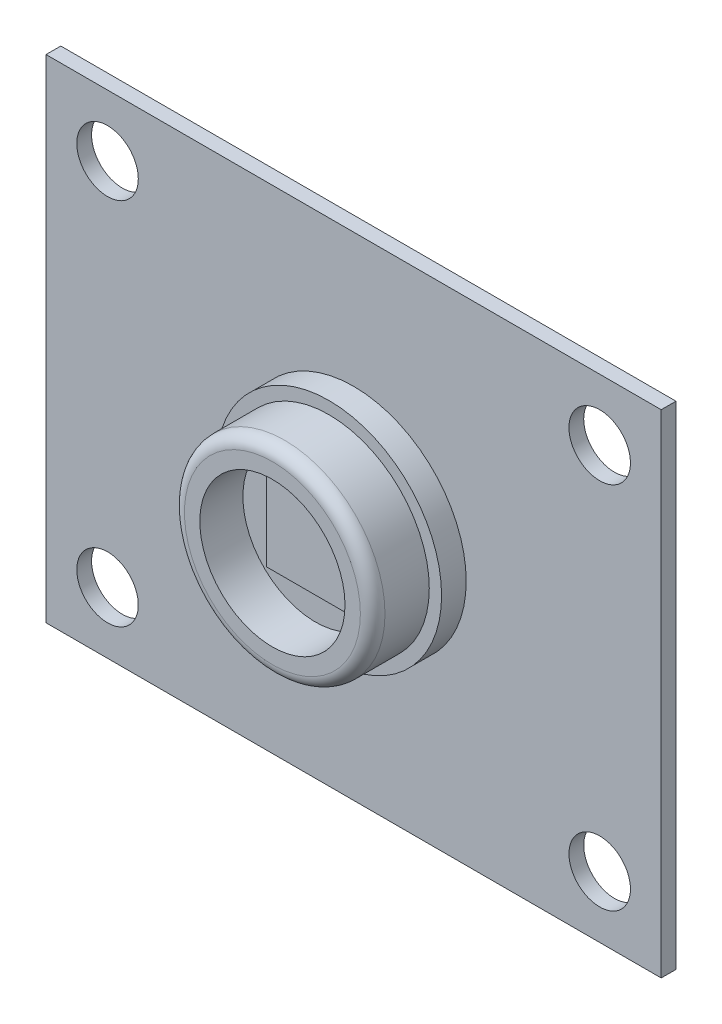
ISO-10303-21;
HEADER;
FILE_DESCRIPTION(('STEP AP214'),'2;1');
FILE_NAME('part.step','',(''),(''),'','','');
FILE_SCHEMA(('AUTOMOTIVE_DESIGN { 1 0 10303 214 1 1 1 1 }'));
ENDSEC;
DATA;
#1=APPLICATION_CONTEXT('core data for automotive mechanical design processes');
#2=APPLICATION_PROTOCOL_DEFINITION('international standard','automotive_design',2000,#1);
#3=PRODUCT_CONTEXT('',#1,'mechanical');
#4=PRODUCT('Part','Part','',(#3));
#5=PRODUCT_RELATED_PRODUCT_CATEGORY('part','',(#4));
#6=PRODUCT_DEFINITION_FORMATION('','',#4);
#7=PRODUCT_DEFINITION_CONTEXT('part definition',#1,'design');
#8=PRODUCT_DEFINITION('design','',#6,#7);
#9=PRODUCT_DEFINITION_SHAPE('','',#8);
#10=(LENGTH_UNIT() NAMED_UNIT(*) SI_UNIT(.MILLI.,.METRE.));
#11=(NAMED_UNIT(*) PLANE_ANGLE_UNIT() SI_UNIT($,.RADIAN.));
#12=(NAMED_UNIT(*) SI_UNIT($,.STERADIAN.) SOLID_ANGLE_UNIT());
#13=UNCERTAINTY_MEASURE_WITH_UNIT(LENGTH_MEASURE(1.E-05),#10,'distance_accuracy_value','');
#14=(GEOMETRIC_REPRESENTATION_CONTEXT(3) GLOBAL_UNCERTAINTY_ASSIGNED_CONTEXT((#13)) GLOBAL_UNIT_ASSIGNED_CONTEXT((#10,
#11,#12)) REPRESENTATION_CONTEXT('',''));
#15=CARTESIAN_POINT('',(0.,0.,0.));
#16=DIRECTION('',(0.,0.,1.));
#17=DIRECTION('',(1.,0.,0.));
#18=AXIS2_PLACEMENT_3D('',#15,#16,#17);
#19=CARTESIAN_POINT('',(1.9,-1.9,-1.65));
#20=DIRECTION('',(-1.,0.,0.));
#21=DIRECTION('',(0.,0.,1.));
#22=AXIS2_PLACEMENT_3D('',#19,#20,#21);
#23=PLANE('',#22);
#24=DIRECTION('',(0.,1.,0.));
#25=VECTOR('',#24,1.);
#26=CARTESIAN_POINT('',(1.9,-1.9,-1.75));
#27=LINE('',#26,#25);
#28=CARTESIAN_POINT('',(1.9,-1.9,-1.75));
#29=VERTEX_POINT('',#28);
#30=CARTESIAN_POINT('',(1.9,1.9,-1.75));
#31=VERTEX_POINT('',#30);
#32=EDGE_CURVE('E107',#29,#31,#27,.T.);
#33=ORIENTED_EDGE('',*,*,#32,.T.);
#34=DIRECTION('',(0.,0.,-1.));
#35=VECTOR('',#34,1.);
#36=CARTESIAN_POINT('',(1.9,1.9,-1.65));
#37=LINE('',#36,#35);
#38=CARTESIAN_POINT('',(1.9,1.9,-1.65));
#39=VERTEX_POINT('',#38);
#40=EDGE_CURVE('E12',#39,#31,#37,.T.);
#41=ORIENTED_EDGE('',*,*,#40,.F.);
#42=DIRECTION('',(0.,1.,0.));
#43=VECTOR('',#42,1.);
#44=CARTESIAN_POINT('',(1.9,-1.9,-1.65));
#45=LINE('',#44,#43);
#46=CARTESIAN_POINT('',(1.9,-1.9,-1.65));
#47=VERTEX_POINT('',#46);
#48=EDGE_CURVE('E95',#47,#39,#45,.T.);
#49=ORIENTED_EDGE('',*,*,#48,.F.);
#50=DIRECTION('',(0.,0.,-1.));
#51=VECTOR('',#50,1.);
#52=CARTESIAN_POINT('',(1.9,-1.9,-1.65));
#53=LINE('',#52,#51);
#54=EDGE_CURVE('E103',#47,#29,#53,.T.);
#55=ORIENTED_EDGE('',*,*,#54,.T.);
#56=EDGE_LOOP('',(#33,#41,#49,#55));
#57=FACE_BOUND('',#56,.T.);
#58=ADVANCED_FACE('F44',(#57),#23,.F.);
#59=CARTESIAN_POINT('',(-1.9,1.9,-1.65));
#60=DIRECTION('',(0.,-1.,0.));
#61=DIRECTION('',(0.,0.,-1.));
#62=AXIS2_PLACEMENT_3D('',#59,#60,#61);
#63=PLANE('',#62);
#64=DIRECTION('',(-1.,0.,0.));
#65=VECTOR('',#64,1.);
#66=CARTESIAN_POINT('',(-1.9,1.9,-1.75));
#67=LINE('',#66,#65);
#68=CARTESIAN_POINT('',(-1.9,1.9,-1.75));
#69=VERTEX_POINT('',#68);
#70=EDGE_CURVE('E99',#31,#69,#67,.T.);
#71=ORIENTED_EDGE('',*,*,#70,.T.);
#72=DIRECTION('',(0.,0.,-1.));
#73=VECTOR('',#72,1.);
#74=CARTESIAN_POINT('',(-1.9,1.9,-1.65));
#75=LINE('',#74,#73);
#76=CARTESIAN_POINT('',(-1.9,1.9,-1.65));
#77=VERTEX_POINT('',#76);
#78=EDGE_CURVE('E52',#77,#69,#75,.T.);
#79=ORIENTED_EDGE('',*,*,#78,.F.);
#80=DIRECTION('',(-1.,0.,0.));
#81=VECTOR('',#80,1.);
#82=CARTESIAN_POINT('',(-1.9,1.9,-1.65));
#83=LINE('',#82,#81);
#84=EDGE_CURVE('E90',#39,#77,#83,.T.);
#85=ORIENTED_EDGE('',*,*,#84,.F.);
#86=ORIENTED_EDGE('',*,*,#40,.T.);
#87=EDGE_LOOP('',(#71,#79,#85,#86));
#88=FACE_BOUND('',#87,.T.);
#89=ADVANCED_FACE('F98',(#88),#63,.F.);
#90=CARTESIAN_POINT('',(-1.9,-1.9,-1.65));
#91=DIRECTION('',(1.,0.,0.));
#92=DIRECTION('',(0.,0.,-1.));
#93=AXIS2_PLACEMENT_3D('',#90,#91,#92);
#94=PLANE('',#93);
#95=DIRECTION('',(0.,-1.,0.));
#96=VECTOR('',#95,1.);
#97=CARTESIAN_POINT('',(-1.9,-1.9,-1.75));
#98=LINE('',#97,#96);
#99=CARTESIAN_POINT('',(-1.9,-1.9,-1.75));
#100=VERTEX_POINT('',#99);
#101=EDGE_CURVE('E77',#69,#100,#98,.T.);
#102=ORIENTED_EDGE('',*,*,#101,.T.);
#103=DIRECTION('',(0.,0.,-1.));
#104=VECTOR('',#103,1.);
#105=CARTESIAN_POINT('',(-1.9,-1.9,-1.65));
#106=LINE('',#105,#104);
#107=CARTESIAN_POINT('',(-1.9,-1.9,-1.65));
#108=VERTEX_POINT('',#107);
#109=EDGE_CURVE('E100',#108,#100,#106,.T.);
#110=ORIENTED_EDGE('',*,*,#109,.F.);
#111=DIRECTION('',(0.,-1.,0.));
#112=VECTOR('',#111,1.);
#113=CARTESIAN_POINT('',(-1.9,-1.9,-1.65));
#114=LINE('',#113,#112);
#115=EDGE_CURVE('E93',#77,#108,#114,.T.);
#116=ORIENTED_EDGE('',*,*,#115,.F.);
#117=ORIENTED_EDGE('',*,*,#78,.T.);
#118=EDGE_LOOP('',(#102,#110,#116,#117));
#119=FACE_BOUND('',#118,.T.);
#120=ADVANCED_FACE('F101',(#119),#94,.F.);
#121=CARTESIAN_POINT('',(-1.9,-1.9,-1.65));
#122=DIRECTION('',(0.,1.,0.));
#123=DIRECTION('',(0.,0.,1.));
#124=AXIS2_PLACEMENT_3D('',#121,#122,#123);
#125=PLANE('',#124);
#126=DIRECTION('',(1.,0.,0.));
#127=VECTOR('',#126,1.);
#128=CARTESIAN_POINT('',(-1.9,-1.9,-1.75));
#129=LINE('',#128,#127);
#130=EDGE_CURVE('E83',#100,#29,#129,.T.);
#131=ORIENTED_EDGE('',*,*,#130,.T.);
#132=ORIENTED_EDGE('',*,*,#54,.F.);
#133=DIRECTION('',(1.,0.,0.));
#134=VECTOR('',#133,1.);
#135=CARTESIAN_POINT('',(-1.9,-1.9,-1.65));
#136=LINE('',#135,#134);
#137=EDGE_CURVE('E60',#108,#47,#136,.T.);
#138=ORIENTED_EDGE('',*,*,#137,.F.);
#139=ORIENTED_EDGE('',*,*,#109,.T.);
#140=EDGE_LOOP('',(#131,#132,#138,#139));
#141=FACE_BOUND('',#140,.T.);
#142=ADVANCED_FACE('F114',(#141),#125,.F.);
#143=CARTESIAN_POINT('',(0.,0.,-1.65));
#144=DIRECTION('',(0.,0.,-1.));
#145=DIRECTION('',(-1.,0.,0.));
#146=AXIS2_PLACEMENT_3D('',#143,#144,#145);
#147=PLANE('',#146);
#148=ORIENTED_EDGE('',*,*,#48,.T.);
#149=ORIENTED_EDGE('',*,*,#84,.T.);
#150=ORIENTED_EDGE('',*,*,#115,.T.);
#151=ORIENTED_EDGE('',*,*,#137,.T.);
#152=EDGE_LOOP('',(#148,#149,#150,#151));
#153=FACE_BOUND('',#152,.T.);
#154=ADVANCED_FACE('F91',(#153),#147,.F.);
#155=CARTESIAN_POINT('',(0.,0.,-1.75));
#156=DIRECTION('',(0.,0.,-1.));
#157=DIRECTION('',(-1.,0.,0.));
#158=AXIS2_PLACEMENT_3D('',#155,#156,#157);
#159=PLANE('',#158);
#160=ORIENTED_EDGE('',*,*,#32,.F.);
#161=ORIENTED_EDGE('',*,*,#130,.F.);
#162=ORIENTED_EDGE('',*,*,#101,.F.);
#163=ORIENTED_EDGE('',*,*,#70,.F.);
#164=EDGE_LOOP('',(#160,#161,#162,#163));
#165=FACE_BOUND('',#164,.T.);
#166=ADVANCED_FACE('F117',(#165),#159,.T.);
#167=CLOSED_SHELL('',(#58,#89,#120,#142,#154,#166));
#168=MANIFOLD_SOLID_BREP('B2',#167);
#169=CARTESIAN_POINT('',(0.,0.,-3.3));
#170=DIRECTION('',(0.,0.,1.));
#171=DIRECTION('',(1.,0.,0.));
#172=AXIS2_PLACEMENT_3D('',#169,#170,#171);
#173=CYLINDRICAL_SURFACE('',#172,4.075);
#174=CARTESIAN_POINT('',(0.,0.,-0.5));
#175=DIRECTION('',(0.,0.,1.));
#176=DIRECTION('',(1.,0.,0.));
#177=AXIS2_PLACEMENT_3D('',#174,#175,#176);
#178=CIRCLE('',#177,4.075);
#179=CARTESIAN_POINT('',(4.075,0.,-0.5));
#180=VERTEX_POINT('',#179);
#181=EDGE_CURVE('E270',#180,#180,#178,.F.);
#182=ORIENTED_EDGE('',*,*,#181,.T.);
#183=EDGE_LOOP('',(#182));
#184=FACE_BOUND('',#183,.T.);
#185=CARTESIAN_POINT('',(0.,0.,-2.3));
#186=DIRECTION('',(0.,0.,-1.));
#187=DIRECTION('',(-1.,0.,0.));
#188=AXIS2_PLACEMENT_3D('',#185,#186,#187);
#189=CIRCLE('',#188,4.075);
#190=CARTESIAN_POINT('',(-4.075,0.,-2.3));
#191=VERTEX_POINT('',#190);
#192=EDGE_CURVE('E263',#191,#191,#189,.F.);
#193=ORIENTED_EDGE('',*,*,#192,.T.);
#194=EDGE_LOOP('',(#193));
#195=FACE_BOUND('',#194,.T.);
#196=ADVANCED_FACE('F167',(#184,#195),#173,.T.);
#197=CARTESIAN_POINT('',(0.,0.,0.));
#198=DIRECTION('',(0.,0.,1.));
#199=DIRECTION('',(1.,0.,0.));
#200=AXIS2_PLACEMENT_3D('',#197,#198,#199);
#201=PLANE('',#200);
#202=CARTESIAN_POINT('',(0.,0.,0.));
#203=DIRECTION('',(0.,0.,1.));
#204=DIRECTION('',(1.,0.,0.));
#205=AXIS2_PLACEMENT_3D('',#202,#203,#204);
#206=CIRCLE('',#205,3.575);
#207=CARTESIAN_POINT('',(3.575,0.,0.));
#208=VERTEX_POINT('',#207);
#209=EDGE_CURVE('E268',#208,#208,#206,.T.);
#210=ORIENTED_EDGE('',*,*,#209,.T.);
#211=EDGE_LOOP('',(#210));
#212=FACE_BOUND('',#211,.T.);
#213=CARTESIAN_POINT('',(0.,0.,0.));
#214=DIRECTION('',(0.,0.,1.));
#215=DIRECTION('',(1.,0.,0.));
#216=AXIS2_PLACEMENT_3D('',#213,#214,#215);
#217=CIRCLE('',#216,2.95);
#218=CARTESIAN_POINT('',(2.95,0.,0.));
#219=VERTEX_POINT('',#218);
#220=EDGE_CURVE('E253',#219,#219,#217,.T.);
#221=ORIENTED_EDGE('',*,*,#220,.F.);
#222=EDGE_LOOP('',(#221));
#223=FACE_BOUND('',#222,.T.);
#224=ADVANCED_FACE('F296',(#212,#223),#201,.T.);
#225=CARTESIAN_POINT('',(0.,0.,-2.3));
#226=DIRECTION('',(0.,0.,-1.));
#227=DIRECTION('',(-1.,0.,0.));
#228=AXIS2_PLACEMENT_3D('',#225,#226,#227);
#229=CYLINDRICAL_SURFACE('',#228,4.575);
#230=CARTESIAN_POINT('',(0.,0.,-2.3));
#231=DIRECTION('',(0.,0.,-1.));
#232=DIRECTION('',(-1.,0.,0.));
#233=AXIS2_PLACEMENT_3D('',#230,#231,#232);
#234=CIRCLE('',#233,4.575);
#235=CARTESIAN_POINT('',(-4.575,0.,-2.3));
#236=VERTEX_POINT('',#235);
#237=EDGE_CURVE('E260',#236,#236,#234,.T.);
#238=ORIENTED_EDGE('',*,*,#237,.T.);
#239=EDGE_LOOP('',(#238));
#240=FACE_BOUND('',#239,.T.);
#241=CARTESIAN_POINT('',(0.,0.,-3.3));
#242=DIRECTION('',(0.,0.,-1.));
#243=DIRECTION('',(-1.,0.,0.));
#244=AXIS2_PLACEMENT_3D('',#241,#242,#243);
#245=CIRCLE('',#244,4.575);
#246=CARTESIAN_POINT('',(-4.575,0.,-3.3));
#247=VERTEX_POINT('',#246);
#248=EDGE_CURVE('E257',#247,#247,#245,.T.);
#249=ORIENTED_EDGE('',*,*,#248,.F.);
#250=EDGE_LOOP('',(#249));
#251=FACE_BOUND('',#250,.T.);
#252=ADVANCED_FACE('F300',(#240,#251),#229,.T.);
#253=CARTESIAN_POINT('',(0.,0.,-2.3));
#254=DIRECTION('',(0.,0.,-1.));
#255=DIRECTION('',(-1.,0.,0.));
#256=AXIS2_PLACEMENT_3D('',#253,#254,#255);
#257=PLANE('',#256);
#258=ORIENTED_EDGE('',*,*,#192,.F.);
#259=EDGE_LOOP('',(#258));
#260=FACE_BOUND('',#259,.T.);
#261=ORIENTED_EDGE('',*,*,#237,.F.);
#262=EDGE_LOOP('',(#261));
#263=FACE_BOUND('',#262,.T.);
#264=ADVANCED_FACE('F307',(#260,#263),#257,.F.);
#265=CARTESIAN_POINT('',(0.,0.,-1.75));
#266=DIRECTION('',(0.,0.,1.));
#267=DIRECTION('',(1.,0.,0.));
#268=AXIS2_PLACEMENT_3D('',#265,#266,#267);
#269=CYLINDRICAL_SURFACE('',#268,2.95);
#270=CARTESIAN_POINT('',(0.,0.,-1.75));
#271=DIRECTION('',(0.,0.,1.));
#272=DIRECTION('',(1.,0.,0.));
#273=AXIS2_PLACEMENT_3D('',#270,#271,#272);
#274=CIRCLE('',#273,2.95);
#275=CARTESIAN_POINT('',(2.95,0.,-1.75));
#276=VERTEX_POINT('',#275);
#277=EDGE_CURVE('E254',#276,#276,#274,.T.);
#278=ORIENTED_EDGE('',*,*,#277,.F.);
#279=EDGE_LOOP('',(#278));
#280=FACE_BOUND('',#279,.T.);
#281=ORIENTED_EDGE('',*,*,#220,.T.);
#282=EDGE_LOOP('',(#281));
#283=FACE_BOUND('',#282,.T.);
#284=ADVANCED_FACE('F311',(#280,#283),#269,.F.);
#285=CARTESIAN_POINT('',(0.,0.,-1.75));
#286=DIRECTION('',(0.,0.,1.));
#287=DIRECTION('',(1.,0.,0.));
#288=AXIS2_PLACEMENT_3D('',#285,#286,#287);
#289=PLANE('',#288);
#290=ORIENTED_EDGE('',*,*,#277,.T.);
#291=EDGE_LOOP('',(#290));
#292=FACE_BOUND('',#291,.T.);
#293=ADVANCED_FACE('F315',(#292),#289,.T.);
#294=CARTESIAN_POINT('',(0.,0.,-0.5));
#295=DIRECTION('',(0.,0.,1.));
#296=DIRECTION('',(1.,0.,0.));
#297=AXIS2_PLACEMENT_3D('',#294,#295,#296);
#298=TOROIDAL_SURFACE('',#297,3.575,0.5);
#299=ORIENTED_EDGE('',*,*,#181,.F.);
#300=EDGE_LOOP('',(#299));
#301=FACE_BOUND('',#300,.T.);
#302=ORIENTED_EDGE('',*,*,#209,.F.);
#303=EDGE_LOOP('',(#302));
#304=FACE_BOUND('',#303,.T.);
#305=ADVANCED_FACE('F169',(#301,#304),#298,.T.);
#306=CARTESIAN_POINT('',(0.,0.,-3.3));
#307=DIRECTION('',(0.,0.,1.));
#308=DIRECTION('',(1.,0.,0.));
#309=AXIS2_PLACEMENT_3D('',#306,#307,#308);
#310=PLANE('',#309);
#311=CARTESIAN_POINT('',(10.,-7.5,-3.3));
#312=DIRECTION('',(0.,0.,-1.));
#313=DIRECTION('',(1.,0.,0.));
#314=AXIS2_PLACEMENT_3D('',#311,#312,#313);
#315=CIRCLE('',#314,1.25);
#316=CARTESIAN_POINT('',(11.25,-7.5,-3.3));
#317=VERTEX_POINT('',#316);
#318=EDGE_CURVE('E506',#317,#317,#315,.T.);
#319=ORIENTED_EDGE('',*,*,#318,.T.);
#320=EDGE_LOOP('',(#319));
#321=FACE_BOUND('',#320,.T.);
#322=CARTESIAN_POINT('',(-9.99999999999999,7.5,-3.3));
#323=DIRECTION('',(0.,0.,-1.));
#324=DIRECTION('',(1.,0.,0.));
#325=AXIS2_PLACEMENT_3D('',#322,#323,#324);
#326=CIRCLE('',#325,1.25);
#327=CARTESIAN_POINT('',(-8.75,7.5,-3.3));
#328=VERTEX_POINT('',#327);
#329=EDGE_CURVE('E514',#328,#328,#326,.T.);
#330=ORIENTED_EDGE('',*,*,#329,.T.);
#331=EDGE_LOOP('',(#330));
#332=FACE_BOUND('',#331,.T.);
#333=DIRECTION('',(0.,-1.,0.));
#334=VECTOR('',#333,1.);
#335=CARTESIAN_POINT('',(12.5,10.,-3.3));
#336=LINE('',#335,#334);
#337=CARTESIAN_POINT('',(12.5,10.,-3.3));
#338=VERTEX_POINT('',#337);
#339=CARTESIAN_POINT('',(12.5,-10.,-3.3));
#340=VERTEX_POINT('',#339);
#341=EDGE_CURVE('E237',#338,#340,#336,.T.);
#342=ORIENTED_EDGE('',*,*,#341,.F.);
#343=DIRECTION('',(1.,0.,0.));
#344=VECTOR('',#343,1.);
#345=CARTESIAN_POINT('',(-12.5,10.,-3.3));
#346=LINE('',#345,#344);
#347=CARTESIAN_POINT('',(-12.5,10.,-3.3));
#348=VERTEX_POINT('',#347);
#349=EDGE_CURVE('E208',#348,#338,#346,.T.);
#350=ORIENTED_EDGE('',*,*,#349,.F.);
#351=DIRECTION('',(0.,1.,0.));
#352=VECTOR('',#351,1.);
#353=CARTESIAN_POINT('',(-12.5,10.,-3.3));
#354=LINE('',#353,#352);
#355=CARTESIAN_POINT('',(-12.5,-10.,-3.3));
#356=VERTEX_POINT('',#355);
#357=EDGE_CURVE('E202',#356,#348,#354,.T.);
#358=ORIENTED_EDGE('',*,*,#357,.F.);
#359=DIRECTION('',(-1.,0.,0.));
#360=VECTOR('',#359,1.);
#361=CARTESIAN_POINT('',(-12.5,-10.,-3.3));
#362=LINE('',#361,#360);
#363=EDGE_CURVE('E227',#340,#356,#362,.T.);
#364=ORIENTED_EDGE('',*,*,#363,.F.);
#365=EDGE_LOOP('',(#342,#350,#358,#364));
#366=FACE_BOUND('',#365,.T.);
#367=CARTESIAN_POINT('',(-10.,-7.5,-3.3));
#368=DIRECTION('',(0.,0.,-1.));
#369=DIRECTION('',(-1.,0.,0.));
#370=AXIS2_PLACEMENT_3D('',#367,#368,#369);
#371=CIRCLE('',#370,1.25);
#372=CARTESIAN_POINT('',(-11.25,-7.5,-3.3));
#373=VERTEX_POINT('',#372);
#374=EDGE_CURVE('E520',#373,#373,#371,.T.);
#375=ORIENTED_EDGE('',*,*,#374,.T.);
#376=EDGE_LOOP('',(#375));
#377=FACE_BOUND('',#376,.T.);
#378=CARTESIAN_POINT('',(10.,7.5,-3.3));
#379=DIRECTION('',(0.,0.,-1.));
#380=DIRECTION('',(-1.,0.,0.));
#381=AXIS2_PLACEMENT_3D('',#378,#379,#380);
#382=CIRCLE('',#381,1.25);
#383=CARTESIAN_POINT('',(8.75,7.5,-3.3));
#384=VERTEX_POINT('',#383);
#385=EDGE_CURVE('E508',#384,#384,#382,.T.);
#386=ORIENTED_EDGE('',*,*,#385,.T.);
#387=EDGE_LOOP('',(#386));
#388=FACE_BOUND('',#387,.T.);
#389=ORIENTED_EDGE('',*,*,#248,.T.);
#390=EDGE_LOOP('',(#389));
#391=FACE_BOUND('',#390,.T.);
#392=ADVANCED_FACE('F330',(#321,#332,#366,#377,#388,#391),#310,.T.);
#393=CARTESIAN_POINT('',(0.,0.,-3.9));
#394=DIRECTION('',(0.,0.,1.));
#395=DIRECTION('',(1.,0.,0.));
#396=AXIS2_PLACEMENT_3D('',#393,#394,#395);
#397=PLANE('',#396);
#398=CARTESIAN_POINT('',(-2.5,0.,-3.9));
#399=DIRECTION('',(0.,0.,1.));
#400=DIRECTION('',(1.,0.,0.));
#401=AXIS2_PLACEMENT_3D('',#398,#399,#400);
#402=CIRCLE('',#401,0.225);
#403=CARTESIAN_POINT('',(-2.275,0.,-3.9));
#404=VERTEX_POINT('',#403);
#405=EDGE_CURVE('E42',#404,#404,#402,.T.);
#406=ORIENTED_EDGE('',*,*,#405,.T.);
#407=EDGE_LOOP('',(#406));
#408=FACE_BOUND('',#407,.T.);
#409=CARTESIAN_POINT('',(2.5,0.,-3.9));
#410=DIRECTION('',(0.,0.,1.));
#411=DIRECTION('',(1.,0.,0.));
#412=AXIS2_PLACEMENT_3D('',#409,#410,#411);
#413=CIRCLE('',#412,0.225);
#414=CARTESIAN_POINT('',(2.725,0.,-3.9));
#415=VERTEX_POINT('',#414);
#416=EDGE_CURVE('E171',#415,#415,#413,.T.);
#417=ORIENTED_EDGE('',*,*,#416,.T.);
#418=EDGE_LOOP('',(#417));
#419=FACE_BOUND('',#418,.T.);
#420=DIRECTION('',(0.,-1.,0.));
#421=VECTOR('',#420,1.);
#422=CARTESIAN_POINT('',(12.5,10.,-3.9));
#423=LINE('',#422,#421);
#424=CARTESIAN_POINT('',(12.5,10.,-3.9));
#425=VERTEX_POINT('',#424);
#426=CARTESIAN_POINT('',(12.5,-10.,-3.9));
#427=VERTEX_POINT('',#426);
#428=EDGE_CURVE('E222',#425,#427,#423,.T.);
#429=ORIENTED_EDGE('',*,*,#428,.T.);
#430=DIRECTION('',(-1.,0.,0.));
#431=VECTOR('',#430,1.);
#432=CARTESIAN_POINT('',(-12.5,-10.,-3.9));
#433=LINE('',#432,#431);
#434=CARTESIAN_POINT('',(-12.5,-10.,-3.9));
#435=VERTEX_POINT('',#434);
#436=EDGE_CURVE('E216',#427,#435,#433,.T.);
#437=ORIENTED_EDGE('',*,*,#436,.T.);
#438=DIRECTION('',(0.,1.,0.));
#439=VECTOR('',#438,1.);
#440=CARTESIAN_POINT('',(-12.5,10.,-3.9));
#441=LINE('',#440,#439);
#442=CARTESIAN_POINT('',(-12.5,10.,-3.9));
#443=VERTEX_POINT('',#442);
#444=EDGE_CURVE('E220',#435,#443,#441,.T.);
#445=ORIENTED_EDGE('',*,*,#444,.T.);
#446=DIRECTION('',(1.,0.,0.));
#447=VECTOR('',#446,1.);
#448=CARTESIAN_POINT('',(-12.5,10.,-3.9));
#449=LINE('',#448,#447);
#450=EDGE_CURVE('E185',#443,#425,#449,.T.);
#451=ORIENTED_EDGE('',*,*,#450,.T.);
#452=EDGE_LOOP('',(#429,#437,#445,#451));
#453=FACE_BOUND('',#452,.T.);
#454=CARTESIAN_POINT('',(-10.,-7.5,-3.9));
#455=DIRECTION('',(0.,0.,-1.));
#456=DIRECTION('',(-1.,0.,0.));
#457=AXIS2_PLACEMENT_3D('',#454,#455,#456);
#458=CIRCLE('',#457,1.25);
#459=CARTESIAN_POINT('',(-11.25,-7.5,-3.9));
#460=VERTEX_POINT('',#459);
#461=EDGE_CURVE('E240',#460,#460,#458,.T.);
#462=ORIENTED_EDGE('',*,*,#461,.F.);
#463=EDGE_LOOP('',(#462));
#464=FACE_BOUND('',#463,.T.);
#465=CARTESIAN_POINT('',(-9.99999999999999,7.5,-3.9));
#466=DIRECTION('',(0.,0.,-1.));
#467=DIRECTION('',(1.,0.,0.));
#468=AXIS2_PLACEMENT_3D('',#465,#466,#467);
#469=CIRCLE('',#468,1.25);
#470=CARTESIAN_POINT('',(-8.75,7.5,-3.9));
#471=VERTEX_POINT('',#470);
#472=EDGE_CURVE('E517',#471,#471,#469,.T.);
#473=ORIENTED_EDGE('',*,*,#472,.F.);
#474=EDGE_LOOP('',(#473));
#475=FACE_BOUND('',#474,.T.);
#476=CARTESIAN_POINT('',(10.,7.5,-3.9));
#477=DIRECTION('',(0.,0.,-1.));
#478=DIRECTION('',(-1.,0.,0.));
#479=AXIS2_PLACEMENT_3D('',#476,#477,#478);
#480=CIRCLE('',#479,1.25);
#481=CARTESIAN_POINT('',(8.75,7.5,-3.9));
#482=VERTEX_POINT('',#481);
#483=EDGE_CURVE('E511',#482,#482,#480,.T.);
#484=ORIENTED_EDGE('',*,*,#483,.F.);
#485=EDGE_LOOP('',(#484));
#486=FACE_BOUND('',#485,.T.);
#487=CARTESIAN_POINT('',(10.,-7.5,-3.9));
#488=DIRECTION('',(0.,0.,-1.));
#489=DIRECTION('',(1.,0.,0.));
#490=AXIS2_PLACEMENT_3D('',#487,#488,#489);
#491=CIRCLE('',#490,1.25);
#492=CARTESIAN_POINT('',(11.25,-7.5,-3.9));
#493=VERTEX_POINT('',#492);
#494=EDGE_CURVE('E503',#493,#493,#491,.T.);
#495=ORIENTED_EDGE('',*,*,#494,.F.);
#496=EDGE_LOOP('',(#495));
#497=FACE_BOUND('',#496,.T.);
#498=ADVANCED_FACE('F217',(#408,#419,#453,#464,#475,#486,#497),#397,.F.);
#499=CARTESIAN_POINT('',(12.5,10.,-3.9));
#500=DIRECTION('',(-1.,0.,0.));
#501=DIRECTION('',(0.,-1.,0.));
#502=AXIS2_PLACEMENT_3D('',#499,#500,#501);
#503=PLANE('',#502);
#504=ORIENTED_EDGE('',*,*,#341,.T.);
#505=DIRECTION('',(0.,0.,1.));
#506=VECTOR('',#505,1.);
#507=CARTESIAN_POINT('',(12.5,-10.,-3.9));
#508=LINE('',#507,#506);
#509=EDGE_CURVE('E228',#427,#340,#508,.T.);
#510=ORIENTED_EDGE('',*,*,#509,.F.);
#511=ORIENTED_EDGE('',*,*,#428,.F.);
#512=DIRECTION('',(0.,0.,1.));
#513=VECTOR('',#512,1.);
#514=CARTESIAN_POINT('',(12.5,10.,-3.9));
#515=LINE('',#514,#513);
#516=EDGE_CURVE('E233',#425,#338,#515,.T.);
#517=ORIENTED_EDGE('',*,*,#516,.T.);
#518=EDGE_LOOP('',(#504,#510,#511,#517));
#519=FACE_BOUND('',#518,.T.);
#520=ADVANCED_FACE('F329',(#519),#503,.F.);
#521=CARTESIAN_POINT('',(-12.5,-10.,-3.9));
#522=DIRECTION('',(0.,1.,0.));
#523=DIRECTION('',(-1.,0.,0.));
#524=AXIS2_PLACEMENT_3D('',#521,#522,#523);
#525=PLANE('',#524);
#526=ORIENTED_EDGE('',*,*,#363,.T.);
#527=DIRECTION('',(0.,0.,1.));
#528=VECTOR('',#527,1.);
#529=CARTESIAN_POINT('',(-12.5,-10.,-3.9));
#530=LINE('',#529,#528);
#531=EDGE_CURVE('E225',#435,#356,#530,.T.);
#532=ORIENTED_EDGE('',*,*,#531,.F.);
#533=ORIENTED_EDGE('',*,*,#436,.F.);
#534=ORIENTED_EDGE('',*,*,#509,.T.);
#535=EDGE_LOOP('',(#526,#532,#533,#534));
#536=FACE_BOUND('',#535,.T.);
#537=ADVANCED_FACE('F226',(#536),#525,.F.);
#538=CARTESIAN_POINT('',(-12.5,10.,-3.9));
#539=DIRECTION('',(1.,0.,0.));
#540=DIRECTION('',(0.,1.,0.));
#541=AXIS2_PLACEMENT_3D('',#538,#539,#540);
#542=PLANE('',#541);
#543=ORIENTED_EDGE('',*,*,#357,.T.);
#544=DIRECTION('',(0.,0.,1.));
#545=VECTOR('',#544,1.);
#546=CARTESIAN_POINT('',(-12.5,10.,-3.9));
#547=LINE('',#546,#545);
#548=EDGE_CURVE('E229',#443,#348,#547,.T.);
#549=ORIENTED_EDGE('',*,*,#548,.F.);
#550=ORIENTED_EDGE('',*,*,#444,.F.);
#551=ORIENTED_EDGE('',*,*,#531,.T.);
#552=EDGE_LOOP('',(#543,#549,#550,#551));
#553=FACE_BOUND('',#552,.T.);
#554=ADVANCED_FACE('F231',(#553),#542,.F.);
#555=CARTESIAN_POINT('',(-12.5,10.,-3.9));
#556=DIRECTION('',(0.,-1.,0.));
#557=DIRECTION('',(1.,0.,0.));
#558=AXIS2_PLACEMENT_3D('',#555,#556,#557);
#559=PLANE('',#558);
#560=ORIENTED_EDGE('',*,*,#349,.T.);
#561=ORIENTED_EDGE('',*,*,#516,.F.);
#562=ORIENTED_EDGE('',*,*,#450,.F.);
#563=ORIENTED_EDGE('',*,*,#548,.T.);
#564=EDGE_LOOP('',(#560,#561,#562,#563));
#565=FACE_BOUND('',#564,.T.);
#566=ADVANCED_FACE('F344',(#565),#559,.F.);
#567=CARTESIAN_POINT('',(-10.,-7.5,-3.9));
#568=DIRECTION('',(0.,0.,1.));
#569=DIRECTION('',(1.,0.,0.));
#570=AXIS2_PLACEMENT_3D('',#567,#568,#569);
#571=CYLINDRICAL_SURFACE('',#570,1.25);
#572=ORIENTED_EDGE('',*,*,#461,.T.);
#573=EDGE_LOOP('',(#572));
#574=FACE_BOUND('',#573,.T.);
#575=ORIENTED_EDGE('',*,*,#374,.F.);
#576=EDGE_LOOP('',(#575));
#577=FACE_BOUND('',#576,.T.);
#578=ADVANCED_FACE('F341',(#574,#577),#571,.F.);
#579=CARTESIAN_POINT('',(-9.99999999999999,7.5,-3.9));
#580=DIRECTION('',(0.,0.,1.));
#581=DIRECTION('',(1.,0.,0.));
#582=AXIS2_PLACEMENT_3D('',#579,#580,#581);
#583=CYLINDRICAL_SURFACE('',#582,1.25);
#584=ORIENTED_EDGE('',*,*,#472,.T.);
#585=EDGE_LOOP('',(#584));
#586=FACE_BOUND('',#585,.T.);
#587=ORIENTED_EDGE('',*,*,#329,.F.);
#588=EDGE_LOOP('',(#587));
#589=FACE_BOUND('',#588,.T.);
#590=ADVANCED_FACE('F368',(#586,#589),#583,.F.);
#591=CARTESIAN_POINT('',(10.,7.5,-3.9));
#592=DIRECTION('',(0.,0.,1.));
#593=DIRECTION('',(1.,0.,0.));
#594=AXIS2_PLACEMENT_3D('',#591,#592,#593);
#595=CYLINDRICAL_SURFACE('',#594,1.25);
#596=ORIENTED_EDGE('',*,*,#483,.T.);
#597=EDGE_LOOP('',(#596));
#598=FACE_BOUND('',#597,.T.);
#599=ORIENTED_EDGE('',*,*,#385,.F.);
#600=EDGE_LOOP('',(#599));
#601=FACE_BOUND('',#600,.T.);
#602=ADVANCED_FACE('F375',(#598,#601),#595,.F.);
#603=CARTESIAN_POINT('',(10.,-7.5,-3.9));
#604=DIRECTION('',(0.,0.,1.));
#605=DIRECTION('',(1.,0.,0.));
#606=AXIS2_PLACEMENT_3D('',#603,#604,#605);
#607=CYLINDRICAL_SURFACE('',#606,1.25);
#608=ORIENTED_EDGE('',*,*,#494,.T.);
#609=EDGE_LOOP('',(#608));
#610=FACE_BOUND('',#609,.T.);
#611=ORIENTED_EDGE('',*,*,#318,.F.);
#612=EDGE_LOOP('',(#611));
#613=FACE_BOUND('',#612,.T.);
#614=ADVANCED_FACE('F291',(#610,#613),#607,.F.);
#615=CARTESIAN_POINT('',(2.5,0.,-4.3));
#616=DIRECTION('',(0.,0.,-1.));
#617=DIRECTION('',(-1.,0.,0.));
#618=AXIS2_PLACEMENT_3D('',#615,#616,#617);
#619=PLANE('',#618);
#620=CARTESIAN_POINT('',(2.5,0.,-4.3));
#621=DIRECTION('',(0.,0.,-1.));
#622=DIRECTION('',(-1.,0.,0.));
#623=AXIS2_PLACEMENT_3D('',#620,#621,#622);
#624=CIRCLE('',#623,0.225);
#625=CARTESIAN_POINT('',(2.275,0.,-4.3));
#626=VERTEX_POINT('',#625);
#627=EDGE_CURVE('E246',#626,#626,#624,.T.);
#628=ORIENTED_EDGE('',*,*,#627,.T.);
#629=EDGE_LOOP('',(#628));
#630=FACE_BOUND('',#629,.T.);
#631=ADVANCED_FACE('F281',(#630),#619,.T.);
#632=CARTESIAN_POINT('',(2.5,0.,-4.3));
#633=DIRECTION('',(0.,0.,1.));
#634=DIRECTION('',(1.,0.,0.));
#635=AXIS2_PLACEMENT_3D('',#632,#633,#634);
#636=CYLINDRICAL_SURFACE('',#635,0.225);
#637=ORIENTED_EDGE('',*,*,#627,.F.);
#638=EDGE_LOOP('',(#637));
#639=FACE_BOUND('',#638,.T.);
#640=ORIENTED_EDGE('',*,*,#416,.F.);
#641=EDGE_LOOP('',(#640));
#642=FACE_BOUND('',#641,.T.);
#643=ADVANCED_FACE('F278',(#639,#642),#636,.T.);
#644=CARTESIAN_POINT('',(-2.5,0.,-4.3));
#645=DIRECTION('',(0.,0.,-1.));
#646=DIRECTION('',(-1.,0.,0.));
#647=AXIS2_PLACEMENT_3D('',#644,#645,#646);
#648=PLANE('',#647);
#649=CARTESIAN_POINT('',(-2.5,0.,-4.3));
#650=DIRECTION('',(0.,0.,-1.));
#651=DIRECTION('',(-1.,0.,0.));
#652=AXIS2_PLACEMENT_3D('',#649,#650,#651);
#653=CIRCLE('',#652,0.225);
#654=CARTESIAN_POINT('',(-2.725,0.,-4.3));
#655=VERTEX_POINT('',#654);
#656=EDGE_CURVE('E250',#655,#655,#653,.T.);
#657=ORIENTED_EDGE('',*,*,#656,.T.);
#658=EDGE_LOOP('',(#657));
#659=FACE_BOUND('',#658,.T.);
#660=ADVANCED_FACE('F280',(#659),#648,.T.);
#661=CARTESIAN_POINT('',(-2.5,0.,-4.3));
#662=DIRECTION('',(0.,0.,1.));
#663=DIRECTION('',(1.,0.,0.));
#664=AXIS2_PLACEMENT_3D('',#661,#662,#663);
#665=CYLINDRICAL_SURFACE('',#664,0.225);
#666=ORIENTED_EDGE('',*,*,#656,.F.);
#667=EDGE_LOOP('',(#666));
#668=FACE_BOUND('',#667,.T.);
#669=ORIENTED_EDGE('',*,*,#405,.F.);
#670=EDGE_LOOP('',(#669));
#671=FACE_BOUND('',#670,.T.);
#672=ADVANCED_FACE('F288',(#668,#671),#665,.T.);
#673=CLOSED_SHELL('',(#196,#224,#252,#264,#284,#293,#305,#392,#498,#520,#537,#554,#566,#578,
#590,#602,#614,#631,#643,#660,#672));
#674=MANIFOLD_SOLID_BREP('B6',#673);
#675=ADVANCED_BREP_SHAPE_REPRESENTATION('',(#18,#168,#674),#14);
#676=SHAPE_DEFINITION_REPRESENTATION(#9,#675);
ENDSEC;
END-ISO-10303-21;
